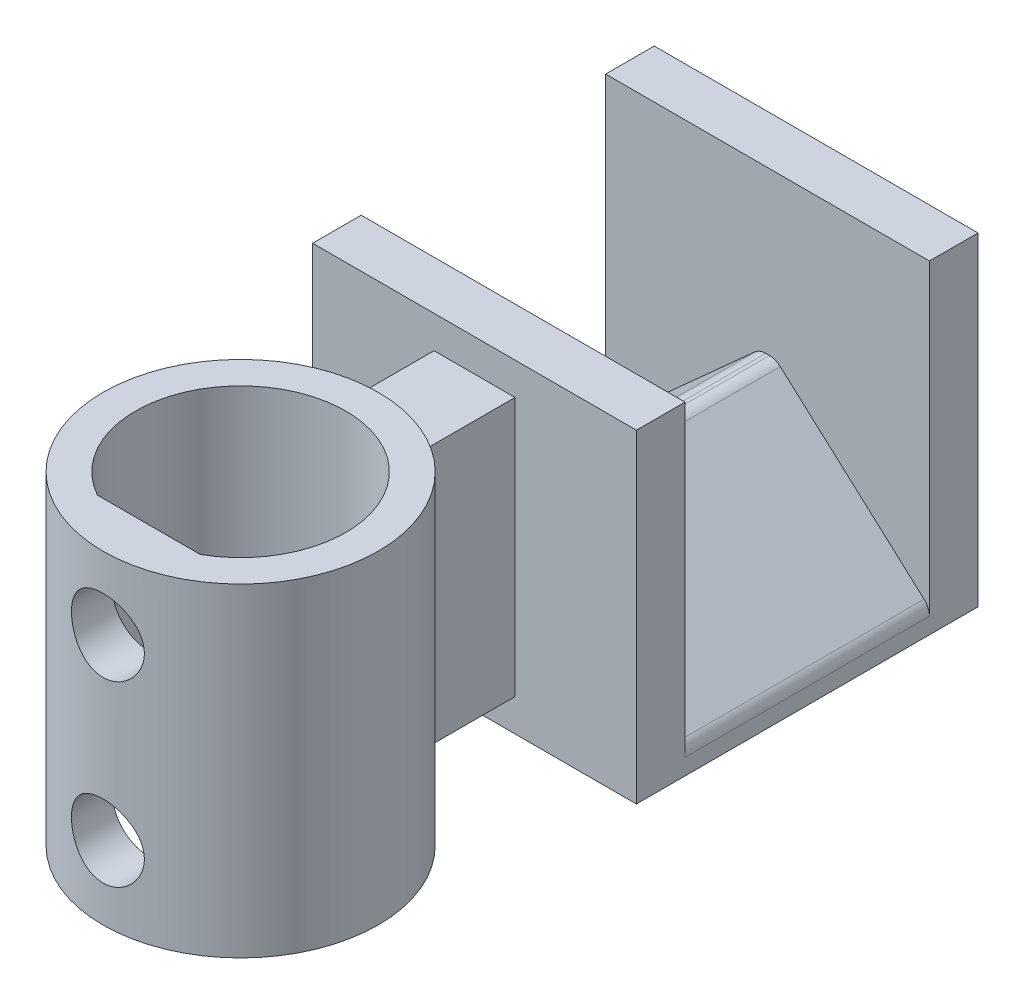
ISO-10303-21;
HEADER;
FILE_DESCRIPTION(('STEP AP214'),'2;1');
FILE_NAME('part.step','',(''),(''),'','','');
FILE_SCHEMA(('AUTOMOTIVE_DESIGN { 1 0 10303 214 1 1 1 1 }'));
ENDSEC;
DATA;
#1=APPLICATION_CONTEXT('core data for automotive mechanical design processes');
#2=APPLICATION_PROTOCOL_DEFINITION('international standard','automotive_design',2000,#1);
#3=PRODUCT_CONTEXT('',#1,'mechanical');
#4=PRODUCT('Part','Part','',(#3));
#5=PRODUCT_RELATED_PRODUCT_CATEGORY('part','',(#4));
#6=PRODUCT_DEFINITION_FORMATION('','',#4);
#7=PRODUCT_DEFINITION_CONTEXT('part definition',#1,'design');
#8=PRODUCT_DEFINITION('design','',#6,#7);
#9=PRODUCT_DEFINITION_SHAPE('','',#8);
#10=(LENGTH_UNIT() NAMED_UNIT(*) SI_UNIT(.MILLI.,.METRE.));
#11=(NAMED_UNIT(*) PLANE_ANGLE_UNIT() SI_UNIT($,.RADIAN.));
#12=(NAMED_UNIT(*) SI_UNIT($,.STERADIAN.) SOLID_ANGLE_UNIT());
#13=UNCERTAINTY_MEASURE_WITH_UNIT(LENGTH_MEASURE(1.E-05),#10,'distance_accuracy_value','');
#14=(GEOMETRIC_REPRESENTATION_CONTEXT(3) GLOBAL_UNCERTAINTY_ASSIGNED_CONTEXT((#13)) GLOBAL_UNIT_ASSIGNED_CONTEXT((#10,
#11,#12)) REPRESENTATION_CONTEXT('',''));
#15=CARTESIAN_POINT('',(0.,0.,0.));
#16=DIRECTION('',(0.,0.,1.));
#17=DIRECTION('',(1.,0.,0.));
#18=AXIS2_PLACEMENT_3D('',#15,#16,#17);
#19=CARTESIAN_POINT('',(0.,39.0416305603426,25.));
#20=DIRECTION('',(0.,-1.,0.));
#21=DIRECTION('',(0.,0.,-1.));
#22=AXIS2_PLACEMENT_3D('',#19,#20,#21);
#23=CYLINDRICAL_SURFACE('',#22,8.5);
#24=CARTESIAN_POINT('',(0.,15.,25.));
#25=DIRECTION('',(0.,-1.,0.));
#26=DIRECTION('',(0.,0.,-1.));
#27=AXIS2_PLACEMENT_3D('',#24,#25,#26);
#28=CIRCLE('',#27,8.5);
#29=CARTESIAN_POINT('',(0.,15.,16.5));
#30=VERTEX_POINT('',#29);
#31=EDGE_CURVE('E186',#30,#30,#28,.T.);
#32=ORIENTED_EDGE('',*,*,#31,.T.);
#33=EDGE_LOOP('',(#32));
#34=FACE_BOUND('',#33,.T.);
#35=CARTESIAN_POINT('',(0.,-5.,25.));
#36=DIRECTION('',(0.,1.,0.));
#37=DIRECTION('',(0.,0.,1.));
#38=AXIS2_PLACEMENT_3D('',#35,#36,#37);
#39=CIRCLE('',#38,8.5);
#40=CARTESIAN_POINT('',(0.,-5.,33.5));
#41=VERTEX_POINT('',#40);
#42=EDGE_CURVE('E192',#41,#41,#39,.F.);
#43=ORIENTED_EDGE('',*,*,#42,.F.);
#44=EDGE_LOOP('',(#43));
#45=FACE_BOUND('',#44,.T.);
#46=CARTESIAN_POINT('',(0.,-3.,25.));
#47=DIRECTION('',(0.,1.,0.));
#48=DIRECTION('',(0.,0.,1.));
#49=AXIS2_PLACEMENT_3D('',#46,#47,#48);
#50=CIRCLE('',#49,8.5);
#51=CARTESIAN_POINT('',(-2.5,-3.,16.875961595364));
#52=VERTEX_POINT('',#51);
#53=CARTESIAN_POINT('',(2.5,-3.,16.875961595364));
#54=VERTEX_POINT('',#53);
#55=EDGE_CURVE('E226',#52,#54,#50,.F.);
#56=ORIENTED_EDGE('',*,*,#55,.T.);
#57=DIRECTION('',(0.,-1.,0.));
#58=VECTOR('',#57,1.);
#59=CARTESIAN_POINT('',(2.5,39.0416305603426,16.875961595364));
#60=LINE('',#59,#58);
#61=CARTESIAN_POINT('',(2.5,13.,16.875961595364));
#62=VERTEX_POINT('',#61);
#63=EDGE_CURVE('E211',#54,#62,#60,.F.);
#64=ORIENTED_EDGE('',*,*,#63,.T.);
#65=CARTESIAN_POINT('',(0.,13.,25.));
#66=DIRECTION('',(0.,-1.,0.));
#67=DIRECTION('',(0.,0.,-1.));
#68=AXIS2_PLACEMENT_3D('',#65,#66,#67);
#69=CIRCLE('',#68,8.5);
#70=CARTESIAN_POINT('',(-2.5,13.,16.875961595364));
#71=VERTEX_POINT('',#70);
#72=EDGE_CURVE('E233',#62,#71,#69,.F.);
#73=ORIENTED_EDGE('',*,*,#72,.T.);
#74=DIRECTION('',(0.,-1.,0.));
#75=VECTOR('',#74,1.);
#76=CARTESIAN_POINT('',(-2.5,39.0416305603426,16.875961595364));
#77=LINE('',#76,#75);
#78=EDGE_CURVE('E230',#71,#52,#77,.T.);
#79=ORIENTED_EDGE('',*,*,#78,.T.);
#80=EDGE_LOOP('',(#56,#64,#73,#79));
#81=FACE_BOUND('',#80,.T.);
#82=CARTESIAN_POINT('',(-2.25,10.5,33.1967981553775));
#83=CARTESIAN_POINT('',(-2.24999694180408,10.6239840002776,33.1968003362435));
#84=CARTESIAN_POINT('',(-2.23971706610501,10.7480005412109,33.1996419584915));
#85=CARTESIAN_POINT('',(-2.198945615888,10.9924544608563,33.2106680196964));
#86=CARTESIAN_POINT('',(-2.16844370713168,11.112889976629,33.2188551904021));
#87=CARTESIAN_POINT('',(-2.0882990785985,11.3466102401079,33.2395815791112));
#88=CARTESIAN_POINT('',(-2.03868300476042,11.459904688051,33.2521147362105));
#89=CARTESIAN_POINT('',(-1.92180166354043,11.6765786826062,33.2801132198881));
#90=CARTESIAN_POINT('',(-1.85453509902009,11.7799574997535,33.2955787619447));
#91=CARTESIAN_POINT('',(-1.70248951742595,11.9764139017784,33.3281265446091));
#92=CARTESIAN_POINT('',(-1.61735395744878,12.0692109081865,33.3452371126252));
#93=CARTESIAN_POINT('',(-1.4327540142738,12.2393902103004,33.3789023677977));
#94=CARTESIAN_POINT('',(-1.33328816547564,12.3167709274061,33.3954569978831));
#95=CARTESIAN_POINT('',(-1.12090838569079,12.4550884366435,33.4264608929721));
#96=CARTESIAN_POINT('',(-1.00780712819347,12.5157466883929,33.4408728427373));
#97=CARTESIAN_POINT('',(-0.772566710508234,12.6170815196129,33.4656427357432));
#98=CARTESIAN_POINT('',(-0.650429055025734,12.6577614172222,33.4760013521304));
#99=CARTESIAN_POINT('',(-0.403511110172187,12.7170778425828,33.4912971460741));
#100=CARTESIAN_POINT('',(-0.278852839843893,12.7361915561904,33.4963515042717));
#101=CARTESIAN_POINT('',(-0.0280034780646866,12.7533339423421,33.5008788349257));
#102=CARTESIAN_POINT('',(0.0981873570184365,12.7513660941808,33.5003527283806));
#103=CARTESIAN_POINT('',(0.34519977639906,12.7267381177659,33.4938644304373));
#104=CARTESIAN_POINT('',(0.466076857336715,12.7045934898765,33.4880376721779));
#105=CARTESIAN_POINT('',(0.702334013138001,12.6410728615727,33.4717623278363));
#106=CARTESIAN_POINT('',(0.817713776487286,12.5996957727456,33.4613134801802));
#107=CARTESIAN_POINT('',(1.04102215095086,12.4984870248307,33.4367663576623));
#108=CARTESIAN_POINT('',(1.14886634833951,12.4384779194592,33.4226332115479));
#109=CARTESIAN_POINT('',(1.3531303740591,12.301844580475,33.3922415251126));
#110=CARTESIAN_POINT('',(1.44954799839656,12.2252171495074,33.375982576028));
#111=CARTESIAN_POINT('',(1.63129857081783,12.0547825542084,33.342521924539));
#112=CARTESIAN_POINT('',(1.71620777876131,11.9605256731685,33.3253065822884));
#113=CARTESIAN_POINT('',(1.86911637013184,11.7589321307718,33.2923181202052));
#114=CARTESIAN_POINT('',(1.93711475347608,11.6515946964081,33.2765450857034));
#115=CARTESIAN_POINT('',(2.05458778503724,11.4259787352489,33.2481731019722));
#116=CARTESIAN_POINT('',(2.10394886477225,11.3076384369629,33.2355937612802));
#117=CARTESIAN_POINT('',(2.18193716023719,11.0639230764637,33.2152779792318));
#118=CARTESIAN_POINT('',(2.21056943128527,10.9385497375025,33.207540357145));
#119=CARTESIAN_POINT('',(2.24556016825425,10.6882860893502,33.1980351929453));
#120=CARTESIAN_POINT('',(2.25255005779307,10.5634903897575,33.1960984643835));
#121=CARTESIAN_POINT('',(2.24579596911986,10.3145136151024,33.1979517680045));
#122=CARTESIAN_POINT('',(2.23205416085442,10.19033247708,33.2017412008412));
#123=CARTESIAN_POINT('',(2.18478304951454,9.94853203437677,33.2144565867633));
#124=CARTESIAN_POINT('',(2.15163187005439,9.83083314067768,33.2232843058655));
#125=CARTESIAN_POINT('',(2.06690749717098,9.60266578735862,33.2449859622244));
#126=CARTESIAN_POINT('',(2.0153319242454,9.49219826384843,33.2578604220901));
#127=CARTESIAN_POINT('',(1.89393612864426,9.27898360406455,33.2865532711528));
#128=CARTESIAN_POINT('',(1.82374430356199,9.17645600255329,33.3024294781708));
#129=CARTESIAN_POINT('',(1.66757023068808,8.98440278488017,33.3352002454647));
#130=CARTESIAN_POINT('',(1.58158505971235,8.89487958119961,33.3520949938724));
#131=CARTESIAN_POINT('',(1.39334723217788,8.72876291555247,33.3855805923336));
#132=CARTESIAN_POINT('',(1.29070161878611,8.65260935870141,33.4021491503459));
#133=CARTESIAN_POINT('',(1.07371678547403,8.51861464758931,33.4326221761272));
#134=CARTESIAN_POINT('',(0.959378187911347,8.46077251937521,33.4465267855714));
#135=CARTESIAN_POINT('',(0.723057226149525,8.36557056201773,33.470015772103));
#136=CARTESIAN_POINT('',(0.60113959611423,8.32805833034544,33.4796321961789));
#137=CARTESIAN_POINT('',(0.352439036803731,8.2741367860407,33.4936022569498));
#138=CARTESIAN_POINT('',(0.225657174963255,8.25772287044393,33.4979570415506));
#139=CARTESIAN_POINT('',(-0.0250604722587875,8.24674873433714,33.5008598374346));
#140=CARTESIAN_POINT('',(-0.148966409472797,8.2515427679478,33.499579436696));
#141=CARTESIAN_POINT('',(-0.394141954180563,8.28135153536109,33.4917428575153));
#142=CARTESIAN_POINT('',(-0.515411657917084,8.30636552970252,33.4851868720061));
#143=CARTESIAN_POINT('',(-0.751107699159933,8.37554121781611,33.4675689262979));
#144=CARTESIAN_POINT('',(-0.865574416324465,8.41957360028427,33.4565374265752));
#145=CARTESIAN_POINT('',(-1.08556048681217,8.5254205314973,33.4311229382255));
#146=CARTESIAN_POINT('',(-1.19107859706731,8.58723754551755,33.4167394850088));
#147=CARTESIAN_POINT('',(-1.39318530515942,8.72879850578497,33.3856885458129));
#148=CARTESIAN_POINT('',(-1.48946543719377,8.80897181418192,33.3689708718519));
#149=CARTESIAN_POINT('',(-1.66742398064291,8.98415288335479,33.3353414220771));
#150=CARTESIAN_POINT('',(-1.74909856114583,9.07916452389294,33.3184295965731));
#151=CARTESIAN_POINT('',(-1.8972708258445,9.2837921479421,33.285906991571));
#152=CARTESIAN_POINT('',(-1.96340296292341,9.39367904330234,33.2703321637851));
#153=CARTESIAN_POINT('',(-2.07615948784757,9.62341015894324,33.2427515934587));
#154=CARTESIAN_POINT('',(-2.12279681152532,9.74324771294936,33.2307434857482));
#155=CARTESIAN_POINT('',(-2.18903256232817,9.96889360228065,33.2133487458215));
#156=CARTESIAN_POINT('',(-2.21184214669942,10.0737109686333,33.2071920574266));
#157=CARTESIAN_POINT('',(-2.24232635318084,10.2856776239988,33.1989160421293));
#158=CARTESIAN_POINT('',(-2.25000264354342,10.3928266546586,33.1967962702092));
#159=CARTESIAN_POINT('',(-2.25,10.5,33.1967981553775));
#160=B_SPLINE_CURVE_WITH_KNOTS('',3,(#82,#83,#84,#85,#86,#87,#88,#89,#90,#91,#92,#93,#94,#95,
#96,#97,#98,#99,#100,#101,#102,#103,#104,#105,#106,#107,#108,#109,#110,#111,#112,#113,#114,#115,
#116,#117,#118,#119,#120,#121,#122,#123,#124,#125,#126,#127,#128,#129,#130,#131,#132,#133,#134,
#135,#136,#137,#138,#139,#140,#141,#142,#143,#144,#145,#146,#147,#148,#149,#150,#151,#152,#153,
#154,#155,#156,#157,#158,#159),.UNSPECIFIED.,.T.,.F.,(4,2,2,2,2,2,2,2,2,2,2,2,2,2,2,2,2,2,2,2,2,
2,2,2,2,2,2,2,2,2,2,2,2,2,2,2,2,2,4),(0.,0.37155797163531,0.743305970231715,1.11453760110695,
1.48579652152091,1.86532086241599,2.24488404596034,2.63043245150024,3.01591680090743,
3.39269333716487,3.76940769129443,4.13675920765004,4.50413151587257,4.87511584526133,
5.24617161521628,5.62845622010334,6.01076342740043,6.3953640456007,6.77987083621654,
7.15304843134813,7.52618696941451,7.89228731518204,8.25843495975225,8.63252754907452,
9.00668944894658,9.39148781847044,9.77626571779774,10.1581177737158,10.539886507824,
10.9101123860205,11.2803247253535,11.6480585642679,12.0158434024024,12.3933170752266,
12.7708896114263,13.156610044578,13.5420741241071,13.8632889681006,14.1844684002793),.UNSPECIFIED.);
#161=CARTESIAN_POINT('',(-2.25,10.5,33.1967981553775));
#162=VERTEX_POINT('',#161);
#163=EDGE_CURVE('E198',#162,#162,#160,.T.);
#164=ORIENTED_EDGE('',*,*,#163,.T.);
#165=EDGE_LOOP('',(#164));
#166=FACE_BOUND('',#165,.T.);
#167=CARTESIAN_POINT('',(-2.25,-0.500000000000002,33.1967981553775));
#168=CARTESIAN_POINT('',(-2.24999694180408,-0.376015999722374,33.1968003362435));
#169=CARTESIAN_POINT('',(-2.23971706610501,-0.251999458789078,33.1996419584915));
#170=CARTESIAN_POINT('',(-2.198945615888,-0.00754553914369019,33.2106680196964));
#171=CARTESIAN_POINT('',(-2.16844370713168,0.112889976628972,33.2188551904021));
#172=CARTESIAN_POINT('',(-2.0882990785985,0.346610240107896,33.2395815791112));
#173=CARTESIAN_POINT('',(-2.03868300476042,0.459904688051024,33.2521147362105));
#174=CARTESIAN_POINT('',(-1.92180166354043,0.676578682606188,33.2801132198881));
#175=CARTESIAN_POINT('',(-1.85453509902009,0.779957499753548,33.2955787619447));
#176=CARTESIAN_POINT('',(-1.70248951742595,0.976413901778359,33.3281265446091));
#177=CARTESIAN_POINT('',(-1.61735395744878,1.06921090818649,33.3452371126252));
#178=CARTESIAN_POINT('',(-1.4327540142738,1.23939021030035,33.3789023677977));
#179=CARTESIAN_POINT('',(-1.33328816547564,1.31677092740614,33.3954569978831));
#180=CARTESIAN_POINT('',(-1.12090838569079,1.45508843664353,33.426460892972));
#181=CARTESIAN_POINT('',(-1.00780712819347,1.51574668839292,33.4408728427372));
#182=CARTESIAN_POINT('',(-0.772566710508234,1.6170815196129,33.4656427357431));
#183=CARTESIAN_POINT('',(-0.650429055025735,1.65776141722221,33.4760013521304));
#184=CARTESIAN_POINT('',(-0.403511110172187,1.71707784258281,33.4912971460741));
#185=CARTESIAN_POINT('',(-0.278852839843893,1.73619155619042,33.4963515042717));
#186=CARTESIAN_POINT('',(-0.0280034780646869,1.75333394234214,33.5008788349257));
#187=CARTESIAN_POINT('',(0.0981873570184361,1.75136609418084,33.5003527283806));
#188=CARTESIAN_POINT('',(0.34519977639906,1.72673811776592,33.4938644304373));
#189=CARTESIAN_POINT('',(0.466076857336715,1.70459348987647,33.4880376721779));
#190=CARTESIAN_POINT('',(0.702334013138001,1.6410728615727,33.4717623278363));
#191=CARTESIAN_POINT('',(0.817713776487285,1.59969577274563,33.4613134801802));
#192=CARTESIAN_POINT('',(1.04102215095086,1.49848702483075,33.4367663576623));
#193=CARTESIAN_POINT('',(1.14886634833951,1.43847791945919,33.4226332115479));
#194=CARTESIAN_POINT('',(1.3531303740591,1.30184458047502,33.3922415251126));
#195=CARTESIAN_POINT('',(1.44954799839656,1.22521714950741,33.375982576028));
#196=CARTESIAN_POINT('',(1.63129857081783,1.05478255420836,33.342521924539));
#197=CARTESIAN_POINT('',(1.71620777876131,0.960525673168511,33.3253065822884));
#198=CARTESIAN_POINT('',(1.86911637013183,0.758932130771777,33.2923181202052));
#199=CARTESIAN_POINT('',(1.93711475347608,0.651594696408099,33.2765450857034));
#200=CARTESIAN_POINT('',(2.05458778503724,0.425978735248875,33.2481731019722));
#201=CARTESIAN_POINT('',(2.10394886477225,0.307638436962872,33.2355937612802));
#202=CARTESIAN_POINT('',(2.18193716023719,0.0639230764637289,33.2152779792318));
#203=CARTESIAN_POINT('',(2.21056943128527,-0.0614502624975041,33.207540357145));
#204=CARTESIAN_POINT('',(2.24556016825425,-0.311713910649751,33.1980351929453));
#205=CARTESIAN_POINT('',(2.25255005779307,-0.436509610242537,33.1960984643835));
#206=CARTESIAN_POINT('',(2.24579596911986,-0.685486384897617,33.1979517680045));
#207=CARTESIAN_POINT('',(2.23205416085442,-0.809667522920008,33.2017412008412));
#208=CARTESIAN_POINT('',(2.18478304951454,-1.05146796562323,33.2144565867633));
#209=CARTESIAN_POINT('',(2.15163187005439,-1.16916685932232,33.2232843058654));
#210=CARTESIAN_POINT('',(2.06690749717098,-1.39733421264138,33.2449859622244));
#211=CARTESIAN_POINT('',(2.0153319242454,-1.50780173615157,33.2578604220901));
#212=CARTESIAN_POINT('',(1.89393612864426,-1.72101639593545,33.2865532711528));
#213=CARTESIAN_POINT('',(1.82374430356199,-1.82354399744671,33.3024294781708));
#214=CARTESIAN_POINT('',(1.66757023068808,-2.01559721511983,33.3352002454647));
#215=CARTESIAN_POINT('',(1.58158505971235,-2.10512041880039,33.3520949938724));
#216=CARTESIAN_POINT('',(1.39334723217788,-2.27123708444753,33.3855805923336));
#217=CARTESIAN_POINT('',(1.29070161878611,-2.34739064129859,33.4021491503459));
#218=CARTESIAN_POINT('',(1.07371678547403,-2.48138535241069,33.4326221761272));
#219=CARTESIAN_POINT('',(0.959378187911347,-2.53922748062479,33.4465267855714));
#220=CARTESIAN_POINT('',(0.723057226149525,-2.63442943798227,33.470015772103));
#221=CARTESIAN_POINT('',(0.60113959611423,-2.67194166965456,33.4796321961789));
#222=CARTESIAN_POINT('',(0.352439036803731,-2.7258632139593,33.4936022569498));
#223=CARTESIAN_POINT('',(0.225657174963256,-2.74227712955607,33.4979570415506));
#224=CARTESIAN_POINT('',(-0.0250604722587871,-2.75325126566286,33.5008598374346));
#225=CARTESIAN_POINT('',(-0.148966409472797,-2.7484572320522,33.499579436696));
#226=CARTESIAN_POINT('',(-0.394141954180563,-2.71864846463891,33.4917428575153));
#227=CARTESIAN_POINT('',(-0.515411657917083,-2.69363447029748,33.4851868720061));
#228=CARTESIAN_POINT('',(-0.751107699159933,-2.62445878218389,33.4675689262979));
#229=CARTESIAN_POINT('',(-0.865574416324465,-2.58042639971573,33.4565374265752));
#230=CARTESIAN_POINT('',(-1.08556048681217,-2.4745794685027,33.4311229382255));
#231=CARTESIAN_POINT('',(-1.19107859706731,-2.41276245448245,33.4167394850088));
#232=CARTESIAN_POINT('',(-1.39318530515942,-2.27120149421503,33.3856885458129));
#233=CARTESIAN_POINT('',(-1.48946543719377,-2.19102818581808,33.3689708718519));
#234=CARTESIAN_POINT('',(-1.66742398064291,-2.01584711664521,33.3353414220771));
#235=CARTESIAN_POINT('',(-1.74909856114582,-1.92083547610706,33.3184295965731));
#236=CARTESIAN_POINT('',(-1.8972708258445,-1.7162078520579,33.285906991571));
#237=CARTESIAN_POINT('',(-1.96340296292341,-1.60632095669767,33.2703321637851));
#238=CARTESIAN_POINT('',(-2.07615948784757,-1.37658984105676,33.2427515934587));
#239=CARTESIAN_POINT('',(-2.12279681152532,-1.25675228705065,33.2307434857482));
#240=CARTESIAN_POINT('',(-2.18903256232817,-1.03110639771935,33.2133487458215));
#241=CARTESIAN_POINT('',(-2.21184214669942,-0.92628903136672,33.2071920574266));
#242=CARTESIAN_POINT('',(-2.24232635318084,-0.714322376001232,33.1989160421293));
#243=CARTESIAN_POINT('',(-2.25000264354342,-0.607173345341352,33.1967962702092));
#244=CARTESIAN_POINT('',(-2.25,-0.500000000000002,33.1967981553775));
#245=B_SPLINE_CURVE_WITH_KNOTS('',3,(#167,#168,#169,#170,#171,#172,#173,#174,#175,#176,#177,
#178,#179,#180,#181,#182,#183,#184,#185,#186,#187,#188,#189,#190,#191,#192,#193,#194,#195,#196,
#197,#198,#199,#200,#201,#202,#203,#204,#205,#206,#207,#208,#209,#210,#211,#212,#213,#214,#215,
#216,#217,#218,#219,#220,#221,#222,#223,#224,#225,#226,#227,#228,#229,#230,#231,#232,#233,#234,
#235,#236,#237,#238,#239,#240,#241,#242,#243,#244),.UNSPECIFIED.,.T.,.F.,(4,2,2,2,2,2,2,2,2,2,2,
2,2,2,2,2,2,2,2,2,2,2,2,2,2,2,2,2,2,2,2,2,2,2,2,2,2,2,4),(0.,0.371557971635309,
0.743305970231715,1.11453760110695,1.48579652152091,1.86532086241599,2.24488404596033,
2.63043245150024,3.01591680090743,3.39269333716487,3.76940769129443,4.13675920765004,
4.50413151587256,4.87511584526133,5.24617161521628,5.62845622010334,6.01076342740043,
6.3953640456007,6.77987083621654,7.15304843134812,7.5261869694145,7.89228731518204,
8.25843495975225,8.63252754907452,9.00668944894658,9.39148781847044,9.77626571779773,
10.1581177737158,10.539886507824,10.9101123860205,11.2803247253535,11.6480585642679,
12.0158434024024,12.3933170752266,12.7708896114263,13.156610044578,13.5420741241071,
13.8632889681006,14.1844684002793),.UNSPECIFIED.);
#246=CARTESIAN_POINT('',(-2.25,-0.500000000000002,33.1967981553775));
#247=VERTEX_POINT('',#246);
#248=EDGE_CURVE('E616',#247,#247,#245,.T.);
#249=ORIENTED_EDGE('',*,*,#248,.T.);
#250=EDGE_LOOP('',(#249));
#251=FACE_BOUND('',#250,.T.);
#252=ADVANCED_FACE('F35',(#34,#45,#81,#166,#251),#23,.T.);
#253=CARTESIAN_POINT('',(0.,0.,10.55));
#254=DIRECTION('',(0.,0.,1.));
#255=DIRECTION('',(1.,0.,0.));
#256=AXIS2_PLACEMENT_3D('',#253,#254,#255);
#257=PLANE('',#256);
#258=DIRECTION('',(0.,1.,0.));
#259=VECTOR('',#258,1.);
#260=CARTESIAN_POINT('',(10.,15.,10.55));
#261=LINE('',#260,#259);
#262=CARTESIAN_POINT('',(10.,-5.,10.55));
#263=VERTEX_POINT('',#262);
#264=CARTESIAN_POINT('',(10.,15.,10.55));
#265=VERTEX_POINT('',#264);
#266=EDGE_CURVE('E263',#263,#265,#261,.T.);
#267=ORIENTED_EDGE('',*,*,#266,.T.);
#268=DIRECTION('',(-1.,0.,0.));
#269=VECTOR('',#268,1.);
#270=CARTESIAN_POINT('',(-10.,15.,10.55));
#271=LINE('',#270,#269);
#272=CARTESIAN_POINT('',(-10.,15.,10.55));
#273=VERTEX_POINT('',#272);
#274=EDGE_CURVE('E266',#265,#273,#271,.T.);
#275=ORIENTED_EDGE('',*,*,#274,.T.);
#276=DIRECTION('',(0.,-1.,0.));
#277=VECTOR('',#276,1.);
#278=CARTESIAN_POINT('',(-10.,15.,10.55));
#279=LINE('',#278,#277);
#280=CARTESIAN_POINT('',(-10.,-5.,10.55));
#281=VERTEX_POINT('',#280);
#282=EDGE_CURVE('E269',#273,#281,#279,.T.);
#283=ORIENTED_EDGE('',*,*,#282,.T.);
#284=DIRECTION('',(1.,0.,0.));
#285=VECTOR('',#284,1.);
#286=CARTESIAN_POINT('',(-10.,-5.,10.55));
#287=LINE('',#286,#285);
#288=EDGE_CURVE('E272',#281,#263,#287,.T.);
#289=ORIENTED_EDGE('',*,*,#288,.T.);
#290=EDGE_LOOP('',(#267,#275,#283,#289));
#291=FACE_BOUND('',#290,.T.);
#292=DIRECTION('',(-1.,0.,0.));
#293=VECTOR('',#292,1.);
#294=CARTESIAN_POINT('',(-2.5,13.,10.55));
#295=LINE('',#294,#293);
#296=CARTESIAN_POINT('',(2.5,13.,10.55));
#297=VERTEX_POINT('',#296);
#298=CARTESIAN_POINT('',(-2.5,13.,10.55));
#299=VERTEX_POINT('',#298);
#300=EDGE_CURVE('E215',#297,#299,#295,.T.);
#301=ORIENTED_EDGE('',*,*,#300,.F.);
#302=DIRECTION('',(0.,1.,0.));
#303=VECTOR('',#302,1.);
#304=CARTESIAN_POINT('',(2.5,13.,10.55));
#305=LINE('',#304,#303);
#306=CARTESIAN_POINT('',(2.5,-3.,10.55));
#307=VERTEX_POINT('',#306);
#308=EDGE_CURVE('E219',#307,#297,#305,.T.);
#309=ORIENTED_EDGE('',*,*,#308,.F.);
#310=DIRECTION('',(1.,0.,0.));
#311=VECTOR('',#310,1.);
#312=CARTESIAN_POINT('',(-2.5,-3.,10.55));
#313=LINE('',#312,#311);
#314=CARTESIAN_POINT('',(-2.5,-3.,10.55));
#315=VERTEX_POINT('',#314);
#316=EDGE_CURVE('E208',#315,#307,#313,.T.);
#317=ORIENTED_EDGE('',*,*,#316,.F.);
#318=DIRECTION('',(0.,-1.,0.));
#319=VECTOR('',#318,1.);
#320=CARTESIAN_POINT('',(-2.5,13.,10.55));
#321=LINE('',#320,#319);
#322=EDGE_CURVE('E52',#299,#315,#321,.T.);
#323=ORIENTED_EDGE('',*,*,#322,.F.);
#324=EDGE_LOOP('',(#301,#309,#317,#323));
#325=FACE_BOUND('',#324,.T.);
#326=ADVANCED_FACE('F396',(#291,#325),#257,.T.);
#327=CARTESIAN_POINT('',(10.,-5.,7.55));
#328=DIRECTION('',(-1.,0.,0.));
#329=DIRECTION('',(0.,0.,1.));
#330=AXIS2_PLACEMENT_3D('',#327,#328,#329);
#331=PLANE('',#330);
#332=DIRECTION('',(0.,0.,-1.));
#333=VECTOR('',#332,1.);
#334=CARTESIAN_POINT('',(10.,-5.,7.55));
#335=LINE('',#334,#333);
#336=CARTESIAN_POINT('',(10.,-5.,-10.55));
#337=VERTEX_POINT('',#336);
#338=EDGE_CURVE('E290',#263,#337,#335,.T.);
#339=ORIENTED_EDGE('',*,*,#338,.T.);
#340=DIRECTION('',(0.,1.,0.));
#341=VECTOR('',#340,1.);
#342=CARTESIAN_POINT('',(10.,15.,-10.55));
#343=LINE('',#342,#341);
#344=CARTESIAN_POINT('',(10.,15.,-10.55));
#345=VERTEX_POINT('',#344);
#346=EDGE_CURVE('E238',#337,#345,#343,.T.);
#347=ORIENTED_EDGE('',*,*,#346,.T.);
#348=DIRECTION('',(0.,0.,1.));
#349=VECTOR('',#348,1.);
#350=CARTESIAN_POINT('',(10.,15.,-10.55));
#351=LINE('',#350,#349);
#352=CARTESIAN_POINT('',(10.,15.,-7.55));
#353=VERTEX_POINT('',#352);
#354=EDGE_CURVE('E251',#345,#353,#351,.T.);
#355=ORIENTED_EDGE('',*,*,#354,.T.);
#356=DIRECTION('',(0.,1.,0.));
#357=VECTOR('',#356,1.);
#358=CARTESIAN_POINT('',(10.,15.,-7.55));
#359=LINE('',#358,#357);
#360=CARTESIAN_POINT('',(10.,-3.99906710613802,-7.55));
#361=VERTEX_POINT('',#360);
#362=EDGE_CURVE('E229',#361,#353,#359,.T.);
#363=ORIENTED_EDGE('',*,*,#362,.F.);
#364=DIRECTION('',(0.,0.,-1.));
#365=VECTOR('',#364,1.);
#366=CARTESIAN_POINT('',(10.,-3.99906710613802,7.55));
#367=LINE('',#366,#365);
#368=CARTESIAN_POINT('',(10.,-3.99906710613802,7.55));
#369=VERTEX_POINT('',#368);
#370=EDGE_CURVE('E336',#361,#369,#367,.F.);
#371=ORIENTED_EDGE('',*,*,#370,.T.);
#372=DIRECTION('',(0.,1.,0.));
#373=VECTOR('',#372,1.);
#374=CARTESIAN_POINT('',(10.,15.,7.55));
#375=LINE('',#374,#373);
#376=CARTESIAN_POINT('',(10.,15.,7.55));
#377=VERTEX_POINT('',#376);
#378=EDGE_CURVE('E262',#369,#377,#375,.T.);
#379=ORIENTED_EDGE('',*,*,#378,.T.);
#380=DIRECTION('',(0.,0.,-1.));
#381=VECTOR('',#380,1.);
#382=CARTESIAN_POINT('',(10.,15.,10.55));
#383=LINE('',#382,#381);
#384=EDGE_CURVE('E283',#265,#377,#383,.T.);
#385=ORIENTED_EDGE('',*,*,#384,.F.);
#386=ORIENTED_EDGE('',*,*,#266,.F.);
#387=EDGE_LOOP('',(#339,#347,#355,#363,#371,#379,#385,#386));
#388=FACE_BOUND('',#387,.T.);
#389=ADVANCED_FACE('F374',(#388),#331,.F.);
#390=CARTESIAN_POINT('',(-10.,5.,7.55));
#391=DIRECTION('',(0.,-1.,0.));
#392=DIRECTION('',(0.,0.,-1.));
#393=AXIS2_PLACEMENT_3D('',#390,#391,#392);
#394=PLANE('',#393);
#395=DIRECTION('',(-1.,0.,0.));
#396=VECTOR('',#395,1.);
#397=CARTESIAN_POINT('',(-10.,5.,7.55));
#398=LINE('',#397,#396);
#399=CARTESIAN_POINT('',(0.116135964964549,5.,7.55));
#400=VERTEX_POINT('',#399);
#401=CARTESIAN_POINT('',(-0.116135964964544,5.,7.55));
#402=VERTEX_POINT('',#401);
#403=EDGE_CURVE('E287',#400,#402,#398,.T.);
#404=ORIENTED_EDGE('',*,*,#403,.F.);
#405=DIRECTION('',(0.,0.,1.));
#406=VECTOR('',#405,1.);
#407=CARTESIAN_POINT('',(0.116135964964549,5.,-7.55));
#408=LINE('',#407,#406);
#409=CARTESIAN_POINT('',(0.116135964964549,5.,-7.55));
#410=VERTEX_POINT('',#409);
#411=EDGE_CURVE('E11',#400,#410,#408,.F.);
#412=ORIENTED_EDGE('',*,*,#411,.T.);
#413=DIRECTION('',(-1.,0.,0.));
#414=VECTOR('',#413,1.);
#415=CARTESIAN_POINT('',(-10.,5.,-7.55));
#416=LINE('',#415,#414);
#417=CARTESIAN_POINT('',(-0.116135964964544,5.,-7.55));
#418=VERTEX_POINT('',#417);
#419=EDGE_CURVE('E286',#410,#418,#416,.T.);
#420=ORIENTED_EDGE('',*,*,#419,.T.);
#421=DIRECTION('',(0.,0.,-1.));
#422=VECTOR('',#421,1.);
#423=CARTESIAN_POINT('',(-0.116135964964544,5.,7.55));
#424=LINE('',#423,#422);
#425=EDGE_CURVE('E44',#418,#402,#424,.F.);
#426=ORIENTED_EDGE('',*,*,#425,.T.);
#427=EDGE_LOOP('',(#404,#412,#420,#426));
#428=FACE_BOUND('',#427,.T.);
#429=ADVANCED_FACE('F344',(#428),#394,.F.);
#430=CARTESIAN_POINT('',(-10.,-5.,7.55));
#431=DIRECTION('',(1.,0.,0.));
#432=DIRECTION('',(0.,0.,-1.));
#433=AXIS2_PLACEMENT_3D('',#430,#431,#432);
#434=PLANE('',#433);
#435=DIRECTION('',(0.,0.,-1.));
#436=VECTOR('',#435,1.);
#437=CARTESIAN_POINT('',(-10.,-5.,7.55));
#438=LINE('',#437,#436);
#439=CARTESIAN_POINT('',(-10.,-5.,-10.55));
#440=VERTEX_POINT('',#439);
#441=EDGE_CURVE('E293',#281,#440,#438,.T.);
#442=ORIENTED_EDGE('',*,*,#441,.F.);
#443=ORIENTED_EDGE('',*,*,#282,.F.);
#444=DIRECTION('',(0.,0.,-1.));
#445=VECTOR('',#444,1.);
#446=CARTESIAN_POINT('',(-10.,15.,10.55));
#447=LINE('',#446,#445);
#448=CARTESIAN_POINT('',(-10.,15.,7.55));
#449=VERTEX_POINT('',#448);
#450=EDGE_CURVE('E275',#273,#449,#447,.T.);
#451=ORIENTED_EDGE('',*,*,#450,.T.);
#452=DIRECTION('',(0.,-1.,0.));
#453=VECTOR('',#452,1.);
#454=CARTESIAN_POINT('',(-10.,15.,7.55));
#455=LINE('',#454,#453);
#456=CARTESIAN_POINT('',(-10.,-3.99906710613802,7.55));
#457=VERTEX_POINT('',#456);
#458=EDGE_CURVE('E267',#449,#457,#455,.T.);
#459=ORIENTED_EDGE('',*,*,#458,.T.);
#460=DIRECTION('',(0.,0.,1.));
#461=VECTOR('',#460,1.);
#462=CARTESIAN_POINT('',(-10.,-3.99906710613802,-7.55));
#463=LINE('',#462,#461);
#464=CARTESIAN_POINT('',(-10.,-3.99906710613802,-7.55));
#465=VERTEX_POINT('',#464);
#466=EDGE_CURVE('E307',#457,#465,#463,.F.);
#467=ORIENTED_EDGE('',*,*,#466,.T.);
#468=DIRECTION('',(0.,-1.,0.));
#469=VECTOR('',#468,1.);
#470=CARTESIAN_POINT('',(-10.,15.,-7.55));
#471=LINE('',#470,#469);
#472=CARTESIAN_POINT('',(-10.,15.,-7.55));
#473=VERTEX_POINT('',#472);
#474=EDGE_CURVE('E253',#473,#465,#471,.T.);
#475=ORIENTED_EDGE('',*,*,#474,.F.);
#476=DIRECTION('',(0.,0.,1.));
#477=VECTOR('',#476,1.);
#478=CARTESIAN_POINT('',(-10.,15.,-10.55));
#479=LINE('',#478,#477);
#480=CARTESIAN_POINT('',(-10.,15.,-10.55));
#481=VERTEX_POINT('',#480);
#482=EDGE_CURVE('E260',#481,#473,#479,.T.);
#483=ORIENTED_EDGE('',*,*,#482,.F.);
#484=DIRECTION('',(0.,-1.,0.));
#485=VECTOR('',#484,1.);
#486=CARTESIAN_POINT('',(-10.,15.,-10.55));
#487=LINE('',#486,#485);
#488=EDGE_CURVE('E245',#481,#440,#487,.T.);
#489=ORIENTED_EDGE('',*,*,#488,.T.);
#490=EDGE_LOOP('',(#442,#443,#451,#459,#467,#475,#483,#489));
#491=FACE_BOUND('',#490,.T.);
#492=ADVANCED_FACE('F365',(#491),#434,.F.);
#493=CARTESIAN_POINT('',(-10.,-5.,7.55));
#494=DIRECTION('',(0.,1.,0.));
#495=DIRECTION('',(0.,0.,1.));
#496=AXIS2_PLACEMENT_3D('',#493,#494,#495);
#497=PLANE('',#496);
#498=ORIENTED_EDGE('',*,*,#441,.T.);
#499=DIRECTION('',(1.,0.,0.));
#500=VECTOR('',#499,1.);
#501=CARTESIAN_POINT('',(-10.,-5.,-10.55));
#502=LINE('',#501,#500);
#503=EDGE_CURVE('E241',#440,#337,#502,.T.);
#504=ORIENTED_EDGE('',*,*,#503,.T.);
#505=ORIENTED_EDGE('',*,*,#338,.F.);
#506=ORIENTED_EDGE('',*,*,#288,.F.);
#507=EDGE_LOOP('',(#498,#504,#505,#506));
#508=FACE_BOUND('',#507,.T.);
#509=ADVANCED_FACE('F384',(#508),#497,.F.);
#510=CARTESIAN_POINT('',(0.499999999999964,5.,7.55));
#511=DIRECTION('',(-0.669130606358857,-0.743144825477396,0.));
#512=DIRECTION('',(0.,0.,-1.));
#513=AXIS2_PLACEMENT_3D('',#510,#511,#512);
#514=PLANE('',#513);
#515=DIRECTION('',(0.743144825477396,-0.669130606358857,0.));
#516=VECTOR('',#515,1.);
#517=CARTESIAN_POINT('',(0.499999999999964,5.,7.55));
#518=LINE('',#517,#516);
#519=CARTESIAN_POINT('',(9.66913060635886,-3.25592228066062,7.55));
#520=VERTEX_POINT('',#519);
#521=CARTESIAN_POINT('',(0.785266571323406,4.7431448254774,7.55));
#522=VERTEX_POINT('',#521);
#523=EDGE_CURVE('E304',#520,#522,#518,.F.);
#524=ORIENTED_EDGE('',*,*,#523,.F.);
#525=DIRECTION('',(0.,0.,1.));
#526=VECTOR('',#525,1.);
#527=CARTESIAN_POINT('',(9.66913060635886,-3.25592228066062,-7.55));
#528=LINE('',#527,#526);
#529=CARTESIAN_POINT('',(9.66913060635886,-3.25592228066062,-7.55));
#530=VERTEX_POINT('',#529);
#531=EDGE_CURVE('E341',#520,#530,#528,.F.);
#532=ORIENTED_EDGE('',*,*,#531,.T.);
#533=DIRECTION('',(-0.743144825477396,0.669130606358857,0.));
#534=VECTOR('',#533,1.);
#535=CARTESIAN_POINT('',(2.71017262260375,3.00995163201119,-7.55));
#536=LINE('',#535,#534);
#537=CARTESIAN_POINT('',(0.785266571323406,4.7431448254774,-7.55));
#538=VERTEX_POINT('',#537);
#539=EDGE_CURVE('E298',#538,#530,#536,.F.);
#540=ORIENTED_EDGE('',*,*,#539,.F.);
#541=DIRECTION('',(0.,0.,-1.));
#542=VECTOR('',#541,1.);
#543=CARTESIAN_POINT('',(0.785266571323406,4.7431448254774,7.55));
#544=LINE('',#543,#542);
#545=EDGE_CURVE('E339',#538,#522,#544,.F.);
#546=ORIENTED_EDGE('',*,*,#545,.T.);
#547=EDGE_LOOP('',(#524,#532,#540,#546));
#548=FACE_BOUND('',#547,.T.);
#549=ADVANCED_FACE('F382',(#548),#514,.F.);
#550=CARTESIAN_POINT('',(-10.,-3.55383842082948,7.55));
#551=DIRECTION('',(0.669130606358857,-0.743144825477396,0.));
#552=DIRECTION('',(0.,0.,-1.));
#553=AXIS2_PLACEMENT_3D('',#550,#551,#552);
#554=PLANE('',#553);
#555=DIRECTION('',(-0.743144825477396,-0.669130606358857,0.));
#556=VECTOR('',#555,1.);
#557=CARTESIAN_POINT('',(-2.71017262260375,3.00995163201119,-7.55));
#558=LINE('',#557,#556);
#559=CARTESIAN_POINT('',(-9.66913060635885,-3.25592228066062,-7.55));
#560=VERTEX_POINT('',#559);
#561=CARTESIAN_POINT('',(-0.7852665713234,4.74314482547739,-7.55));
#562=VERTEX_POINT('',#561);
#563=EDGE_CURVE('E295',#560,#562,#558,.F.);
#564=ORIENTED_EDGE('',*,*,#563,.F.);
#565=DIRECTION('',(0.,0.,-1.));
#566=VECTOR('',#565,1.);
#567=CARTESIAN_POINT('',(-9.66913060635885,-3.25592228066062,7.55));
#568=LINE('',#567,#566);
#569=CARTESIAN_POINT('',(-9.66913060635885,-3.25592228066062,7.55));
#570=VERTEX_POINT('',#569);
#571=EDGE_CURVE('E324',#560,#570,#568,.F.);
#572=ORIENTED_EDGE('',*,*,#571,.T.);
#573=DIRECTION('',(0.743144825477396,0.669130606358857,0.));
#574=VECTOR('',#573,1.);
#575=CARTESIAN_POINT('',(-10.,-3.55383842082948,7.55));
#576=LINE('',#575,#574);
#577=CARTESIAN_POINT('',(-0.7852665713234,4.7431448254774,7.55));
#578=VERTEX_POINT('',#577);
#579=EDGE_CURVE('E301',#578,#570,#576,.F.);
#580=ORIENTED_EDGE('',*,*,#579,.F.);
#581=DIRECTION('',(0.,0.,1.));
#582=VECTOR('',#581,1.);
#583=CARTESIAN_POINT('',(-0.7852665713234,4.7431448254774,-7.55));
#584=LINE('',#583,#582);
#585=EDGE_CURVE('E322',#578,#562,#584,.F.);
#586=ORIENTED_EDGE('',*,*,#585,.T.);
#587=EDGE_LOOP('',(#564,#572,#580,#586));
#588=FACE_BOUND('',#587,.T.);
#589=ADVANCED_FACE('F358',(#588),#554,.F.);
#590=CARTESIAN_POINT('',(-9.,-3.99906710613802,7.55));
#591=DIRECTION('',(0.,0.,-1.));
#592=DIRECTION('',(-1.,0.,0.));
#593=AXIS2_PLACEMENT_3D('',#590,#591,#592);
#594=CYLINDRICAL_SURFACE('',#593,1.);
#595=CARTESIAN_POINT('',(-9.,-3.99906710613802,7.55));
#596=DIRECTION('',(0.,0.,-1.));
#597=DIRECTION('',(-1.,0.,0.));
#598=AXIS2_PLACEMENT_3D('',#595,#596,#597);
#599=CIRCLE('',#598,1.);
#600=EDGE_CURVE('E333',#570,#457,#599,.F.);
#601=ORIENTED_EDGE('',*,*,#600,.F.);
#602=ORIENTED_EDGE('',*,*,#571,.F.);
#603=CARTESIAN_POINT('',(-9.,-3.99906710613802,-7.55));
#604=DIRECTION('',(0.,0.,-1.));
#605=DIRECTION('',(-1.,0.,0.));
#606=AXIS2_PLACEMENT_3D('',#603,#604,#605);
#607=CIRCLE('',#606,1.);
#608=EDGE_CURVE('E319',#465,#560,#607,.T.);
#609=ORIENTED_EDGE('',*,*,#608,.F.);
#610=ORIENTED_EDGE('',*,*,#466,.F.);
#611=EDGE_LOOP('',(#601,#602,#609,#610));
#612=FACE_BOUND('',#611,.T.);
#613=ADVANCED_FACE('F390',(#612),#594,.T.);
#614=CARTESIAN_POINT('',(9.00000000000001,-3.99906710613802,7.55));
#615=DIRECTION('',(0.,0.,1.));
#616=DIRECTION('',(1.,0.,0.));
#617=AXIS2_PLACEMENT_3D('',#614,#615,#616);
#618=CYLINDRICAL_SURFACE('',#617,1.);
#619=CARTESIAN_POINT('',(9.00000000000001,-3.99906710613802,-7.55));
#620=DIRECTION('',(0.,0.,-1.));
#621=DIRECTION('',(-1.,0.,0.));
#622=AXIS2_PLACEMENT_3D('',#619,#620,#621);
#623=CIRCLE('',#622,1.);
#624=EDGE_CURVE('E316',#530,#361,#623,.T.);
#625=ORIENTED_EDGE('',*,*,#624,.F.);
#626=ORIENTED_EDGE('',*,*,#531,.F.);
#627=CARTESIAN_POINT('',(9.00000000000001,-3.99906710613802,7.55));
#628=DIRECTION('',(0.,0.,-1.));
#629=DIRECTION('',(-1.,0.,0.));
#630=AXIS2_PLACEMENT_3D('',#627,#628,#629);
#631=CIRCLE('',#630,1.);
#632=EDGE_CURVE('E330',#369,#520,#631,.F.);
#633=ORIENTED_EDGE('',*,*,#632,.F.);
#634=ORIENTED_EDGE('',*,*,#370,.F.);
#635=EDGE_LOOP('',(#625,#626,#633,#634));
#636=FACE_BOUND('',#635,.T.);
#637=ADVANCED_FACE('F379',(#636),#618,.T.);
#638=CARTESIAN_POINT('',(0.116135964964549,4.,7.55));
#639=DIRECTION('',(0.,0.,-1.));
#640=DIRECTION('',(-1.,0.,0.));
#641=AXIS2_PLACEMENT_3D('',#638,#639,#640);
#642=CYLINDRICAL_SURFACE('',#641,1.);
#643=CARTESIAN_POINT('',(0.116135964964549,4.,7.55));
#644=DIRECTION('',(0.,0.,-1.));
#645=DIRECTION('',(-1.,0.,0.));
#646=AXIS2_PLACEMENT_3D('',#643,#644,#645);
#647=CIRCLE('',#646,1.);
#648=EDGE_CURVE('E327',#522,#400,#647,.F.);
#649=ORIENTED_EDGE('',*,*,#648,.F.);
#650=ORIENTED_EDGE('',*,*,#545,.F.);
#651=CARTESIAN_POINT('',(0.116135964964549,4.,-7.55));
#652=DIRECTION('',(0.,0.,-1.));
#653=DIRECTION('',(-1.,0.,0.));
#654=AXIS2_PLACEMENT_3D('',#651,#652,#653);
#655=CIRCLE('',#654,1.);
#656=EDGE_CURVE('E313',#410,#538,#655,.T.);
#657=ORIENTED_EDGE('',*,*,#656,.F.);
#658=ORIENTED_EDGE('',*,*,#411,.F.);
#659=EDGE_LOOP('',(#649,#650,#657,#658));
#660=FACE_BOUND('',#659,.T.);
#661=ADVANCED_FACE('F353',(#660),#642,.T.);
#662=CARTESIAN_POINT('',(-0.116135964964544,4.,7.55));
#663=DIRECTION('',(0.,0.,1.));
#664=DIRECTION('',(1.,0.,0.));
#665=AXIS2_PLACEMENT_3D('',#662,#663,#664);
#666=CYLINDRICAL_SURFACE('',#665,1.);
#667=CARTESIAN_POINT('',(-0.116135964964544,4.,-7.55));
#668=DIRECTION('',(0.,0.,-1.));
#669=DIRECTION('',(-1.,0.,0.));
#670=AXIS2_PLACEMENT_3D('',#667,#668,#669);
#671=CIRCLE('',#670,1.);
#672=EDGE_CURVE('E310',#562,#418,#671,.T.);
#673=ORIENTED_EDGE('',*,*,#672,.F.);
#674=ORIENTED_EDGE('',*,*,#585,.F.);
#675=CARTESIAN_POINT('',(-0.116135964964544,4.,7.55));
#676=DIRECTION('',(0.,0.,-1.));
#677=DIRECTION('',(-1.,0.,0.));
#678=AXIS2_PLACEMENT_3D('',#675,#676,#677);
#679=CIRCLE('',#678,1.);
#680=EDGE_CURVE('E60',#402,#578,#679,.F.);
#681=ORIENTED_EDGE('',*,*,#680,.F.);
#682=ORIENTED_EDGE('',*,*,#425,.F.);
#683=EDGE_LOOP('',(#673,#674,#681,#682));
#684=FACE_BOUND('',#683,.T.);
#685=ADVANCED_FACE('F37',(#684),#666,.T.);
#686=CARTESIAN_POINT('',(-10.,15.,10.55));
#687=DIRECTION('',(0.,-1.,0.));
#688=DIRECTION('',(0.,0.,-1.));
#689=AXIS2_PLACEMENT_3D('',#686,#687,#688);
#690=PLANE('',#689);
#691=DIRECTION('',(-1.,0.,0.));
#692=VECTOR('',#691,1.);
#693=CARTESIAN_POINT('',(-10.,15.,7.55));
#694=LINE('',#693,#692);
#695=EDGE_CURVE('E277',#377,#449,#694,.T.);
#696=ORIENTED_EDGE('',*,*,#695,.T.);
#697=ORIENTED_EDGE('',*,*,#450,.F.);
#698=ORIENTED_EDGE('',*,*,#274,.F.);
#699=ORIENTED_EDGE('',*,*,#384,.T.);
#700=EDGE_LOOP('',(#696,#697,#698,#699));
#701=FACE_BOUND('',#700,.T.);
#702=ADVANCED_FACE('F370',(#701),#690,.F.);
#703=CARTESIAN_POINT('',(0.,0.,7.55));
#704=DIRECTION('',(0.,0.,1.));
#705=DIRECTION('',(1.,0.,0.));
#706=AXIS2_PLACEMENT_3D('',#703,#704,#705);
#707=PLANE('',#706);
#708=ORIENTED_EDGE('',*,*,#579,.T.);
#709=ORIENTED_EDGE('',*,*,#600,.T.);
#710=ORIENTED_EDGE('',*,*,#458,.F.);
#711=ORIENTED_EDGE('',*,*,#695,.F.);
#712=ORIENTED_EDGE('',*,*,#378,.F.);
#713=ORIENTED_EDGE('',*,*,#632,.T.);
#714=ORIENTED_EDGE('',*,*,#523,.T.);
#715=ORIENTED_EDGE('',*,*,#648,.T.);
#716=ORIENTED_EDGE('',*,*,#403,.T.);
#717=ORIENTED_EDGE('',*,*,#680,.T.);
#718=EDGE_LOOP('',(#708,#709,#710,#711,#712,#713,#714,#715,#716,#717));
#719=FACE_BOUND('',#718,.T.);
#720=ADVANCED_FACE('F349',(#719),#707,.F.);
#721=CARTESIAN_POINT('',(-10.,15.,-10.55));
#722=DIRECTION('',(0.,1.,0.));
#723=DIRECTION('',(0.,0.,1.));
#724=AXIS2_PLACEMENT_3D('',#721,#722,#723);
#725=PLANE('',#724);
#726=DIRECTION('',(-1.,0.,0.));
#727=VECTOR('',#726,1.);
#728=CARTESIAN_POINT('',(-10.,15.,-7.55));
#729=LINE('',#728,#727);
#730=EDGE_CURVE('E242',#353,#473,#729,.T.);
#731=ORIENTED_EDGE('',*,*,#730,.F.);
#732=ORIENTED_EDGE('',*,*,#354,.F.);
#733=DIRECTION('',(-1.,0.,0.));
#734=VECTOR('',#733,1.);
#735=CARTESIAN_POINT('',(-10.,15.,-10.55));
#736=LINE('',#735,#734);
#737=EDGE_CURVE('E248',#345,#481,#736,.T.);
#738=ORIENTED_EDGE('',*,*,#737,.T.);
#739=ORIENTED_EDGE('',*,*,#482,.T.);
#740=EDGE_LOOP('',(#731,#732,#738,#739));
#741=FACE_BOUND('',#740,.T.);
#742=ADVANCED_FACE('F435',(#741),#725,.T.);
#743=CARTESIAN_POINT('',(0.,0.,-10.55));
#744=DIRECTION('',(0.,0.,-1.));
#745=DIRECTION('',(1.,0.,0.));
#746=AXIS2_PLACEMENT_3D('',#743,#744,#745);
#747=PLANE('',#746);
#748=ORIENTED_EDGE('',*,*,#346,.F.);
#749=ORIENTED_EDGE('',*,*,#503,.F.);
#750=ORIENTED_EDGE('',*,*,#488,.F.);
#751=ORIENTED_EDGE('',*,*,#737,.F.);
#752=EDGE_LOOP('',(#748,#749,#750,#751));
#753=FACE_BOUND('',#752,.T.);
#754=ADVANCED_FACE('F432',(#753),#747,.T.);
#755=CARTESIAN_POINT('',(0.,0.,-7.55));
#756=DIRECTION('',(0.,0.,-1.));
#757=DIRECTION('',(1.,0.,0.));
#758=AXIS2_PLACEMENT_3D('',#755,#756,#757);
#759=PLANE('',#758);
#760=ORIENTED_EDGE('',*,*,#474,.T.);
#761=ORIENTED_EDGE('',*,*,#608,.T.);
#762=ORIENTED_EDGE('',*,*,#563,.T.);
#763=ORIENTED_EDGE('',*,*,#672,.T.);
#764=ORIENTED_EDGE('',*,*,#419,.F.);
#765=ORIENTED_EDGE('',*,*,#656,.T.);
#766=ORIENTED_EDGE('',*,*,#539,.T.);
#767=ORIENTED_EDGE('',*,*,#624,.T.);
#768=ORIENTED_EDGE('',*,*,#362,.T.);
#769=ORIENTED_EDGE('',*,*,#730,.T.);
#770=EDGE_LOOP('',(#760,#761,#762,#763,#764,#765,#766,#767,#768,#769));
#771=FACE_BOUND('',#770,.T.);
#772=ADVANCED_FACE('F355',(#771),#759,.F.);
#773=CARTESIAN_POINT('',(2.5,13.,33.501));
#774=DIRECTION('',(-1.,0.,0.));
#775=DIRECTION('',(0.,-1.,0.));
#776=AXIS2_PLACEMENT_3D('',#773,#774,#775);
#777=PLANE('',#776);
#778=ORIENTED_EDGE('',*,*,#63,.F.);
#779=DIRECTION('',(0.,0.,-1.));
#780=VECTOR('',#779,1.);
#781=CARTESIAN_POINT('',(2.5,-3.,33.501));
#782=LINE('',#781,#780);
#783=EDGE_CURVE('E204',#54,#307,#782,.T.);
#784=ORIENTED_EDGE('',*,*,#783,.T.);
#785=ORIENTED_EDGE('',*,*,#308,.T.);
#786=DIRECTION('',(0.,0.,-1.));
#787=VECTOR('',#786,1.);
#788=CARTESIAN_POINT('',(2.5,13.,33.501));
#789=LINE('',#788,#787);
#790=EDGE_CURVE('E218',#62,#297,#789,.T.);
#791=ORIENTED_EDGE('',*,*,#790,.F.);
#792=EDGE_LOOP('',(#778,#784,#785,#791));
#793=FACE_BOUND('',#792,.T.);
#794=ADVANCED_FACE('F418',(#793),#777,.F.);
#795=CARTESIAN_POINT('',(-2.5,13.,33.501));
#796=DIRECTION('',(0.,-1.,0.));
#797=DIRECTION('',(0.,0.,-1.));
#798=AXIS2_PLACEMENT_3D('',#795,#796,#797);
#799=PLANE('',#798);
#800=ORIENTED_EDGE('',*,*,#72,.F.);
#801=ORIENTED_EDGE('',*,*,#790,.T.);
#802=ORIENTED_EDGE('',*,*,#300,.T.);
#803=DIRECTION('',(0.,0.,-1.));
#804=VECTOR('',#803,1.);
#805=CARTESIAN_POINT('',(-2.5,13.,33.501));
#806=LINE('',#805,#804);
#807=EDGE_CURVE('E214',#71,#299,#806,.T.);
#808=ORIENTED_EDGE('',*,*,#807,.F.);
#809=EDGE_LOOP('',(#800,#801,#802,#808));
#810=FACE_BOUND('',#809,.T.);
#811=ADVANCED_FACE('F421',(#810),#799,.F.);
#812=CARTESIAN_POINT('',(-2.5,13.,33.501));
#813=DIRECTION('',(1.,0.,0.));
#814=DIRECTION('',(0.,1.,0.));
#815=AXIS2_PLACEMENT_3D('',#812,#813,#814);
#816=PLANE('',#815);
#817=ORIENTED_EDGE('',*,*,#78,.F.);
#818=ORIENTED_EDGE('',*,*,#807,.T.);
#819=ORIENTED_EDGE('',*,*,#322,.T.);
#820=DIRECTION('',(0.,0.,-1.));
#821=VECTOR('',#820,1.);
#822=CARTESIAN_POINT('',(-2.5,-3.,33.501));
#823=LINE('',#822,#821);
#824=EDGE_CURVE('E212',#52,#315,#823,.T.);
#825=ORIENTED_EDGE('',*,*,#824,.F.);
#826=EDGE_LOOP('',(#817,#818,#819,#825));
#827=FACE_BOUND('',#826,.T.);
#828=ADVANCED_FACE('F425',(#827),#816,.F.);
#829=CARTESIAN_POINT('',(-2.5,-3.,33.501));
#830=DIRECTION('',(0.,1.,0.));
#831=DIRECTION('',(0.,0.,1.));
#832=AXIS2_PLACEMENT_3D('',#829,#830,#831);
#833=PLANE('',#832);
#834=ORIENTED_EDGE('',*,*,#55,.F.);
#835=ORIENTED_EDGE('',*,*,#824,.T.);
#836=ORIENTED_EDGE('',*,*,#316,.T.);
#837=ORIENTED_EDGE('',*,*,#783,.F.);
#838=EDGE_LOOP('',(#834,#835,#836,#837));
#839=FACE_BOUND('',#838,.T.);
#840=ADVANCED_FACE('F414',(#839),#833,.F.);
#841=CARTESIAN_POINT('',(0.,39.0416305603426,25.));
#842=DIRECTION('',(0.,-1.,0.));
#843=DIRECTION('',(0.,0.,-1.));
#844=AXIS2_PLACEMENT_3D('',#841,#842,#843);
#845=CYLINDRICAL_SURFACE('',#844,6.5);
#846=CARTESIAN_POINT('',(0.,15.,25.));
#847=DIRECTION('',(0.,-1.,0.));
#848=DIRECTION('',(0.,0.,-1.));
#849=AXIS2_PLACEMENT_3D('',#846,#847,#848);
#850=CIRCLE('',#849,6.5);
#851=CARTESIAN_POINT('',(-3.175,15.,30.6718052681664));
#852=VERTEX_POINT('',#851);
#853=CARTESIAN_POINT('',(3.175,15.,30.6718052681664));
#854=VERTEX_POINT('',#853);
#855=EDGE_CURVE('E181',#852,#854,#850,.T.);
#856=ORIENTED_EDGE('',*,*,#855,.F.);
#857=DIRECTION('',(0.,-1.,0.));
#858=VECTOR('',#857,1.);
#859=CARTESIAN_POINT('',(-3.175,39.0416305603426,30.6718052681664));
#860=LINE('',#859,#858);
#861=CARTESIAN_POINT('',(-3.175,-5.,30.6718052681664));
#862=VERTEX_POINT('',#861);
#863=EDGE_CURVE('E176',#852,#862,#860,.T.);
#864=ORIENTED_EDGE('',*,*,#863,.T.);
#865=CARTESIAN_POINT('',(0.,-5.,25.));
#866=DIRECTION('',(0.,1.,0.));
#867=DIRECTION('',(0.,0.,1.));
#868=AXIS2_PLACEMENT_3D('',#865,#866,#867);
#869=CIRCLE('',#868,6.5);
#870=CARTESIAN_POINT('',(3.175,-5.,30.6718052681664));
#871=VERTEX_POINT('',#870);
#872=EDGE_CURVE('E180',#862,#871,#869,.F.);
#873=ORIENTED_EDGE('',*,*,#872,.T.);
#874=DIRECTION('',(0.,-1.,0.));
#875=VECTOR('',#874,1.);
#876=CARTESIAN_POINT('',(3.175,39.0416305603426,30.6718052681664));
#877=LINE('',#876,#875);
#878=EDGE_CURVE('E185',#854,#871,#877,.T.);
#879=ORIENTED_EDGE('',*,*,#878,.F.);
#880=EDGE_LOOP('',(#856,#864,#873,#879));
#881=FACE_BOUND('',#880,.T.);
#882=ADVANCED_FACE('F178',(#881),#845,.F.);
#883=CARTESIAN_POINT('',(3.175,39.0416305603426,30.6718052681664));
#884=DIRECTION('',(0.,0.,-1.));
#885=DIRECTION('',(-1.,0.,0.));
#886=AXIS2_PLACEMENT_3D('',#883,#884,#885);
#887=PLANE('',#886);
#888=CARTESIAN_POINT('',(0.,-0.500000000000002,30.6718052681664));
#889=DIRECTION('',(0.,0.,-1.));
#890=DIRECTION('',(-1.,0.,0.));
#891=AXIS2_PLACEMENT_3D('',#888,#889,#890);
#892=CIRCLE('',#891,2.25);
#893=CARTESIAN_POINT('',(-2.25,-0.500000000000002,30.6718052681664));
#894=VERTEX_POINT('',#893);
#895=EDGE_CURVE('E39',#894,#894,#892,.F.);
#896=ORIENTED_EDGE('',*,*,#895,.T.);
#897=EDGE_LOOP('',(#896));
#898=FACE_BOUND('',#897,.T.);
#899=CARTESIAN_POINT('',(0.,10.5,30.6718052681664));
#900=DIRECTION('',(0.,0.,-1.));
#901=DIRECTION('',(-1.,0.,0.));
#902=AXIS2_PLACEMENT_3D('',#899,#900,#901);
#903=CIRCLE('',#902,2.25);
#904=CARTESIAN_POINT('',(-2.25,10.5,30.6718052681664));
#905=VERTEX_POINT('',#904);
#906=EDGE_CURVE('E195',#905,#905,#903,.F.);
#907=ORIENTED_EDGE('',*,*,#906,.T.);
#908=EDGE_LOOP('',(#907));
#909=FACE_BOUND('',#908,.T.);
#910=DIRECTION('',(-1.,0.,0.));
#911=VECTOR('',#910,1.);
#912=CARTESIAN_POINT('',(3.175,15.,30.6718052681664));
#913=LINE('',#912,#911);
#914=EDGE_CURVE('E203',#854,#852,#913,.T.);
#915=ORIENTED_EDGE('',*,*,#914,.F.);
#916=ORIENTED_EDGE('',*,*,#878,.T.);
#917=DIRECTION('',(-1.,0.,0.));
#918=VECTOR('',#917,1.);
#919=CARTESIAN_POINT('',(3.175,-5.,30.6718052681664));
#920=LINE('',#919,#918);
#921=EDGE_CURVE('E191',#871,#862,#920,.T.);
#922=ORIENTED_EDGE('',*,*,#921,.T.);
#923=ORIENTED_EDGE('',*,*,#863,.F.);
#924=EDGE_LOOP('',(#915,#916,#922,#923));
#925=FACE_BOUND('',#924,.T.);
#926=ADVANCED_FACE('F194',(#898,#909,#925),#887,.T.);
#927=CARTESIAN_POINT('',(-10.,15.,10.55));
#928=DIRECTION('',(0.,-1.,0.));
#929=DIRECTION('',(0.,0.,-1.));
#930=AXIS2_PLACEMENT_3D('',#927,#928,#929);
#931=PLANE('',#930);
#932=ORIENTED_EDGE('',*,*,#855,.T.);
#933=ORIENTED_EDGE('',*,*,#914,.T.);
#934=EDGE_LOOP('',(#932,#933));
#935=FACE_BOUND('',#934,.T.);
#936=ORIENTED_EDGE('',*,*,#31,.F.);
#937=EDGE_LOOP('',(#936));
#938=FACE_BOUND('',#937,.T.);
#939=ADVANCED_FACE('F410',(#935,#938),#931,.F.);
#940=CARTESIAN_POINT('',(-10.,-5.,7.55));
#941=DIRECTION('',(0.,1.,0.));
#942=DIRECTION('',(0.,0.,1.));
#943=AXIS2_PLACEMENT_3D('',#940,#941,#942);
#944=PLANE('',#943);
#945=ORIENTED_EDGE('',*,*,#42,.T.);
#946=EDGE_LOOP('',(#945));
#947=FACE_BOUND('',#946,.T.);
#948=ORIENTED_EDGE('',*,*,#921,.F.);
#949=ORIENTED_EDGE('',*,*,#872,.F.);
#950=EDGE_LOOP('',(#948,#949));
#951=FACE_BOUND('',#950,.T.);
#952=ADVANCED_FACE('F190',(#947,#951),#944,.F.);
#953=CARTESIAN_POINT('',(0.,10.5,33.501));
#954=DIRECTION('',(0.,0.,-1.));
#955=DIRECTION('',(-1.,0.,0.));
#956=AXIS2_PLACEMENT_3D('',#953,#954,#955);
#957=CYLINDRICAL_SURFACE('',#956,2.25);
#958=ORIENTED_EDGE('',*,*,#906,.F.);
#959=EDGE_LOOP('',(#958));
#960=FACE_BOUND('',#959,.T.);
#961=ORIENTED_EDGE('',*,*,#163,.F.);
#962=EDGE_LOOP('',(#961));
#963=FACE_BOUND('',#962,.T.);
#964=ADVANCED_FACE('F578',(#960,#963),#957,.F.);
#965=CARTESIAN_POINT('',(0.,-0.500000000000002,33.501));
#966=DIRECTION('',(0.,0.,-1.));
#967=DIRECTION('',(-1.,0.,0.));
#968=AXIS2_PLACEMENT_3D('',#965,#966,#967);
#969=CYLINDRICAL_SURFACE('',#968,2.25);
#970=ORIENTED_EDGE('',*,*,#895,.F.);
#971=EDGE_LOOP('',(#970));
#972=FACE_BOUND('',#971,.T.);
#973=ORIENTED_EDGE('',*,*,#248,.F.);
#974=EDGE_LOOP('',(#973));
#975=FACE_BOUND('',#974,.T.);
#976=ADVANCED_FACE('F596',(#972,#975),#969,.F.);
#977=CLOSED_SHELL('',(#252,#326,#389,#429,#492,#509,#549,#589,#613,#637,#661,#685,#702,#720,
#742,#754,#772,#794,#811,#828,#840,#882,#926,#939,#952,#964,#976));
#978=MANIFOLD_SOLID_BREP('B2',#977);
#979=ADVANCED_BREP_SHAPE_REPRESENTATION('',(#18,#978),#14);
#980=SHAPE_DEFINITION_REPRESENTATION(#9,#979);
ENDSEC;
END-ISO-10303-21;
